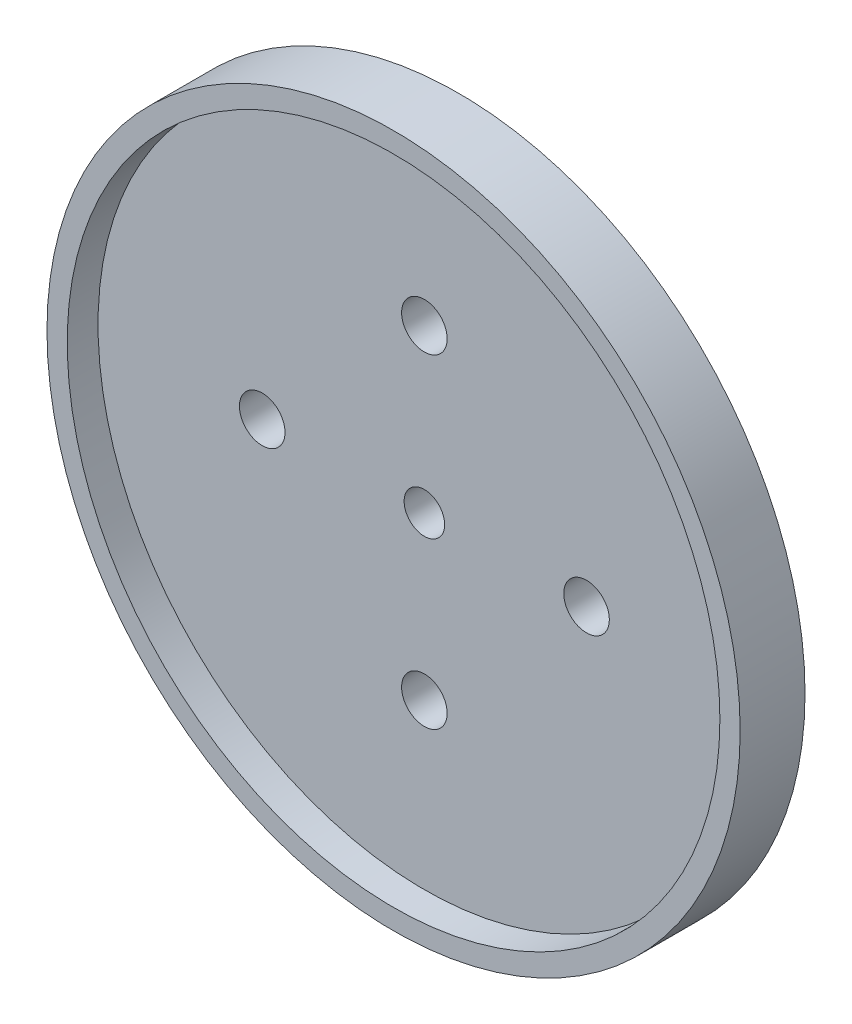
ISO-10303-21;
HEADER;
FILE_DESCRIPTION(('STEP AP214'),'2;1');
FILE_NAME('part.step','',(''),(''),'','','');
FILE_SCHEMA(('AUTOMOTIVE_DESIGN { 1 0 10303 214 1 1 1 1 }'));
ENDSEC;
DATA;
#1=APPLICATION_CONTEXT('core data for automotive mechanical design processes');
#2=APPLICATION_PROTOCOL_DEFINITION('international standard','automotive_design',2000,#1);
#3=PRODUCT_CONTEXT('',#1,'mechanical');
#4=PRODUCT('Part','Part','',(#3));
#5=PRODUCT_RELATED_PRODUCT_CATEGORY('part','',(#4));
#6=PRODUCT_DEFINITION_FORMATION('','',#4);
#7=PRODUCT_DEFINITION_CONTEXT('part definition',#1,'design');
#8=PRODUCT_DEFINITION('design','',#6,#7);
#9=PRODUCT_DEFINITION_SHAPE('','',#8);
#10=(LENGTH_UNIT() NAMED_UNIT(*) SI_UNIT(.MILLI.,.METRE.));
#11=(NAMED_UNIT(*) PLANE_ANGLE_UNIT() SI_UNIT($,.RADIAN.));
#12=(NAMED_UNIT(*) SI_UNIT($,.STERADIAN.) SOLID_ANGLE_UNIT());
#13=UNCERTAINTY_MEASURE_WITH_UNIT(LENGTH_MEASURE(1.E-05),#10,'distance_accuracy_value','');
#14=(GEOMETRIC_REPRESENTATION_CONTEXT(3) GLOBAL_UNCERTAINTY_ASSIGNED_CONTEXT((#13)) GLOBAL_UNIT_ASSIGNED_CONTEXT((#10,
#11,#12)) REPRESENTATION_CONTEXT('',''));
#15=CARTESIAN_POINT('',(0.,0.,0.));
#16=DIRECTION('',(0.,0.,1.));
#17=DIRECTION('',(1.,0.,0.));
#18=AXIS2_PLACEMENT_3D('',#15,#16,#17);
#19=CARTESIAN_POINT('',(0.,0.,10.16));
#20=DIRECTION('',(0.,0.,-1.));
#21=DIRECTION('',(-1.,0.,0.));
#22=AXIS2_PLACEMENT_3D('',#19,#20,#21);
#23=CYLINDRICAL_SURFACE('',#22,54.2925);
#24=CARTESIAN_POINT('',(0.,0.,10.16));
#25=DIRECTION('',(0.,0.,1.));
#26=DIRECTION('',(1.,0.,0.));
#27=AXIS2_PLACEMENT_3D('',#24,#25,#26);
#28=CIRCLE('',#27,54.2925);
#29=CARTESIAN_POINT('',(54.2925,0.,10.16));
#30=VERTEX_POINT('',#29);
#31=EDGE_CURVE('E10',#30,#30,#28,.T.);
#32=ORIENTED_EDGE('',*,*,#31,.F.);
#33=EDGE_LOOP('',(#32));
#34=FACE_BOUND('',#33,.T.);
#35=CARTESIAN_POINT('',(0.,0.,0.));
#36=DIRECTION('',(0.,0.,1.));
#37=DIRECTION('',(1.,0.,0.));
#38=AXIS2_PLACEMENT_3D('',#35,#36,#37);
#39=CIRCLE('',#38,54.2925);
#40=CARTESIAN_POINT('',(54.2925,0.,0.));
#41=VERTEX_POINT('',#40);
#42=EDGE_CURVE('E40',#41,#41,#39,.T.);
#43=ORIENTED_EDGE('',*,*,#42,.T.);
#44=EDGE_LOOP('',(#43));
#45=FACE_BOUND('',#44,.T.);
#46=ADVANCED_FACE('F37',(#34,#45),#23,.T.);
#47=CARTESIAN_POINT('',(0.,0.,10.16));
#48=DIRECTION('',(0.,0.,1.));
#49=DIRECTION('',(1.,0.,0.));
#50=AXIS2_PLACEMENT_3D('',#47,#48,#49);
#51=PLANE('',#50);
#52=CARTESIAN_POINT('',(0.,0.,10.16));
#53=DIRECTION('',(0.,0.,1.));
#54=DIRECTION('',(1.,0.,0.));
#55=AXIS2_PLACEMENT_3D('',#52,#53,#54);
#56=CIRCLE('',#55,51.1175);
#57=CARTESIAN_POINT('',(51.1175,0.,10.16));
#58=VERTEX_POINT('',#57);
#59=EDGE_CURVE('E52',#58,#58,#56,.T.);
#60=ORIENTED_EDGE('',*,*,#59,.F.);
#61=EDGE_LOOP('',(#60));
#62=FACE_BOUND('',#61,.T.);
#63=ORIENTED_EDGE('',*,*,#31,.T.);
#64=EDGE_LOOP('',(#63));
#65=FACE_BOUND('',#64,.T.);
#66=ADVANCED_FACE('F113',(#62,#65),#51,.T.);
#67=CARTESIAN_POINT('',(0.,0.,0.));
#68=DIRECTION('',(0.,0.,1.));
#69=DIRECTION('',(1.,0.,0.));
#70=AXIS2_PLACEMENT_3D('',#67,#68,#69);
#71=PLANE('',#70);
#72=CARTESIAN_POINT('',(2.66051032116535E-13,25.4,0.));
#73=DIRECTION('',(0.,0.,1.));
#74=DIRECTION('',(1.,0.,0.));
#75=AXIS2_PLACEMENT_3D('',#72,#73,#74);
#76=CIRCLE('',#75,3.57124);
#77=CARTESIAN_POINT('',(3.57124000000026,25.4,0.));
#78=VERTEX_POINT('',#77);
#79=EDGE_CURVE('E82',#78,#78,#76,.T.);
#80=ORIENTED_EDGE('',*,*,#79,.T.);
#81=EDGE_LOOP('',(#80));
#82=FACE_BOUND('',#81,.T.);
#83=CARTESIAN_POINT('',(-25.4,1.77367354744357E-13,0.));
#84=DIRECTION('',(0.,0.,1.));
#85=DIRECTION('',(1.,0.,0.));
#86=AXIS2_PLACEMENT_3D('',#83,#84,#85);
#87=CIRCLE('',#86,3.57124);
#88=CARTESIAN_POINT('',(-21.82876,1.77367354744357E-13,0.));
#89=VERTEX_POINT('',#88);
#90=EDGE_CURVE('E76',#89,#89,#87,.T.);
#91=ORIENTED_EDGE('',*,*,#90,.T.);
#92=EDGE_LOOP('',(#91));
#93=FACE_BOUND('',#92,.T.);
#94=CARTESIAN_POINT('',(0.,-25.4,0.));
#95=DIRECTION('',(0.,0.,1.));
#96=DIRECTION('',(1.,0.,0.));
#97=AXIS2_PLACEMENT_3D('',#94,#95,#96);
#98=CIRCLE('',#97,3.57124);
#99=CARTESIAN_POINT('',(3.57123999999991,-25.4,0.));
#100=VERTEX_POINT('',#99);
#101=EDGE_CURVE('E70',#100,#100,#98,.T.);
#102=ORIENTED_EDGE('',*,*,#101,.T.);
#103=EDGE_LOOP('',(#102));
#104=FACE_BOUND('',#103,.T.);
#105=CARTESIAN_POINT('',(25.4,0.,0.));
#106=DIRECTION('',(0.,0.,1.));
#107=DIRECTION('',(1.,0.,0.));
#108=AXIS2_PLACEMENT_3D('',#105,#106,#107);
#109=CIRCLE('',#108,3.57124);
#110=CARTESIAN_POINT('',(28.97124,0.,0.));
#111=VERTEX_POINT('',#110);
#112=EDGE_CURVE('E64',#111,#111,#109,.T.);
#113=ORIENTED_EDGE('',*,*,#112,.T.);
#114=EDGE_LOOP('',(#113));
#115=FACE_BOUND('',#114,.T.);
#116=CARTESIAN_POINT('',(0.,0.,0.));
#117=DIRECTION('',(0.,0.,1.));
#118=DIRECTION('',(1.,0.,0.));
#119=AXIS2_PLACEMENT_3D('',#116,#117,#118);
#120=CIRCLE('',#119,3.17499999999999);
#121=CARTESIAN_POINT('',(3.17499999999999,0.,0.));
#122=VERTEX_POINT('',#121);
#123=EDGE_CURVE('E56',#122,#122,#120,.T.);
#124=ORIENTED_EDGE('',*,*,#123,.T.);
#125=EDGE_LOOP('',(#124));
#126=FACE_BOUND('',#125,.T.);
#127=ORIENTED_EDGE('',*,*,#42,.F.);
#128=EDGE_LOOP('',(#127));
#129=FACE_BOUND('',#128,.T.);
#130=ADVANCED_FACE('F109',(#82,#93,#104,#115,#126,#129),#71,.F.);
#131=CARTESIAN_POINT('',(0.,0.,5.334));
#132=DIRECTION('',(0.,0.,1.));
#133=DIRECTION('',(1.,0.,0.));
#134=AXIS2_PLACEMENT_3D('',#131,#132,#133);
#135=CYLINDRICAL_SURFACE('',#134,51.1175);
#136=CARTESIAN_POINT('',(0.,0.,5.334));
#137=DIRECTION('',(0.,0.,1.));
#138=DIRECTION('',(1.,0.,0.));
#139=AXIS2_PLACEMENT_3D('',#136,#137,#138);
#140=CIRCLE('',#139,51.1175);
#141=CARTESIAN_POINT('',(51.1175,0.,5.334));
#142=VERTEX_POINT('',#141);
#143=EDGE_CURVE('E50',#142,#142,#140,.T.);
#144=ORIENTED_EDGE('',*,*,#143,.F.);
#145=EDGE_LOOP('',(#144));
#146=FACE_BOUND('',#145,.T.);
#147=ORIENTED_EDGE('',*,*,#59,.T.);
#148=EDGE_LOOP('',(#147));
#149=FACE_BOUND('',#148,.T.);
#150=ADVANCED_FACE('F95',(#146,#149),#135,.F.);
#151=CARTESIAN_POINT('',(0.,0.,5.334));
#152=DIRECTION('',(0.,0.,1.));
#153=DIRECTION('',(1.,0.,0.));
#154=AXIS2_PLACEMENT_3D('',#151,#152,#153);
#155=PLANE('',#154);
#156=CARTESIAN_POINT('',(2.66051032116535E-13,25.4,5.334));
#157=DIRECTION('',(0.,0.,1.));
#158=DIRECTION('',(1.,0.,0.));
#159=AXIS2_PLACEMENT_3D('',#156,#157,#158);
#160=CIRCLE('',#159,3.57123999999999);
#161=CARTESIAN_POINT('',(3.57124000000025,25.4,5.334));
#162=VERTEX_POINT('',#161);
#163=EDGE_CURVE('E85',#162,#162,#160,.T.);
#164=ORIENTED_EDGE('',*,*,#163,.F.);
#165=EDGE_LOOP('',(#164));
#166=FACE_BOUND('',#165,.T.);
#167=CARTESIAN_POINT('',(-25.4,1.77367354744357E-13,5.334));
#168=DIRECTION('',(0.,0.,1.));
#169=DIRECTION('',(1.,0.,0.));
#170=AXIS2_PLACEMENT_3D('',#167,#168,#169);
#171=CIRCLE('',#170,3.57123999999999);
#172=CARTESIAN_POINT('',(-21.82876,1.77367354744357E-13,5.334));
#173=VERTEX_POINT('',#172);
#174=EDGE_CURVE('E79',#173,#173,#171,.T.);
#175=ORIENTED_EDGE('',*,*,#174,.F.);
#176=EDGE_LOOP('',(#175));
#177=FACE_BOUND('',#176,.T.);
#178=CARTESIAN_POINT('',(0.,-25.4,5.334));
#179=DIRECTION('',(0.,0.,1.));
#180=DIRECTION('',(1.,0.,0.));
#181=AXIS2_PLACEMENT_3D('',#178,#179,#180);
#182=CIRCLE('',#181,3.57123999999999);
#183=CARTESIAN_POINT('',(3.5712399999999,-25.4,5.334));
#184=VERTEX_POINT('',#183);
#185=EDGE_CURVE('E73',#184,#184,#182,.T.);
#186=ORIENTED_EDGE('',*,*,#185,.F.);
#187=EDGE_LOOP('',(#186));
#188=FACE_BOUND('',#187,.T.);
#189=CARTESIAN_POINT('',(25.4,0.,5.334));
#190=DIRECTION('',(0.,0.,1.));
#191=DIRECTION('',(1.,0.,0.));
#192=AXIS2_PLACEMENT_3D('',#189,#190,#191);
#193=CIRCLE('',#192,3.57123999999999);
#194=CARTESIAN_POINT('',(28.97124,0.,5.334));
#195=VERTEX_POINT('',#194);
#196=EDGE_CURVE('E67',#195,#195,#193,.T.);
#197=ORIENTED_EDGE('',*,*,#196,.F.);
#198=EDGE_LOOP('',(#197));
#199=FACE_BOUND('',#198,.T.);
#200=CARTESIAN_POINT('',(0.,0.,5.334));
#201=DIRECTION('',(0.,0.,1.));
#202=DIRECTION('',(1.,0.,0.));
#203=AXIS2_PLACEMENT_3D('',#200,#201,#202);
#204=CIRCLE('',#203,3.17499999999999);
#205=CARTESIAN_POINT('',(3.17499999999999,0.,5.334));
#206=VERTEX_POINT('',#205);
#207=EDGE_CURVE('E61',#206,#206,#204,.T.);
#208=ORIENTED_EDGE('',*,*,#207,.F.);
#209=EDGE_LOOP('',(#208));
#210=FACE_BOUND('',#209,.T.);
#211=ORIENTED_EDGE('',*,*,#143,.T.);
#212=EDGE_LOOP('',(#211));
#213=FACE_BOUND('',#212,.T.);
#214=ADVANCED_FACE('F91',(#166,#177,#188,#199,#210,#213),#155,.T.);
#215=CARTESIAN_POINT('',(0.,0.,5.334));
#216=DIRECTION('',(0.,0.,1.));
#217=DIRECTION('',(1.,0.,0.));
#218=AXIS2_PLACEMENT_3D('',#215,#216,#217);
#219=CYLINDRICAL_SURFACE('',#218,3.17499999999999);
#220=ORIENTED_EDGE('',*,*,#207,.T.);
#221=EDGE_LOOP('',(#220));
#222=FACE_BOUND('',#221,.T.);
#223=ORIENTED_EDGE('',*,*,#123,.F.);
#224=EDGE_LOOP('',(#223));
#225=FACE_BOUND('',#224,.T.);
#226=ADVANCED_FACE('F94',(#222,#225),#219,.F.);
#227=CARTESIAN_POINT('',(25.4,0.,5.334));
#228=DIRECTION('',(0.,0.,1.));
#229=DIRECTION('',(1.,0.,0.));
#230=AXIS2_PLACEMENT_3D('',#227,#228,#229);
#231=CYLINDRICAL_SURFACE('',#230,3.57123999999999);
#232=ORIENTED_EDGE('',*,*,#112,.F.);
#233=EDGE_LOOP('',(#232));
#234=FACE_BOUND('',#233,.T.);
#235=ORIENTED_EDGE('',*,*,#196,.T.);
#236=EDGE_LOOP('',(#235));
#237=FACE_BOUND('',#236,.T.);
#238=ADVANCED_FACE('F125',(#234,#237),#231,.F.);
#239=CARTESIAN_POINT('',(0.,-25.4,5.334));
#240=DIRECTION('',(0.,0.,1.));
#241=DIRECTION('',(1.,0.,0.));
#242=AXIS2_PLACEMENT_3D('',#239,#240,#241);
#243=CYLINDRICAL_SURFACE('',#242,3.57123999999999);
#244=ORIENTED_EDGE('',*,*,#101,.F.);
#245=EDGE_LOOP('',(#244));
#246=FACE_BOUND('',#245,.T.);
#247=ORIENTED_EDGE('',*,*,#185,.T.);
#248=EDGE_LOOP('',(#247));
#249=FACE_BOUND('',#248,.T.);
#250=ADVANCED_FACE('F129',(#246,#249),#243,.F.);
#251=CARTESIAN_POINT('',(-25.4,1.77367354744357E-13,5.334));
#252=DIRECTION('',(0.,0.,1.));
#253=DIRECTION('',(1.,0.,0.));
#254=AXIS2_PLACEMENT_3D('',#251,#252,#253);
#255=CYLINDRICAL_SURFACE('',#254,3.57123999999999);
#256=ORIENTED_EDGE('',*,*,#90,.F.);
#257=EDGE_LOOP('',(#256));
#258=FACE_BOUND('',#257,.T.);
#259=ORIENTED_EDGE('',*,*,#174,.T.);
#260=EDGE_LOOP('',(#259));
#261=FACE_BOUND('',#260,.T.);
#262=ADVANCED_FACE('F133',(#258,#261),#255,.F.);
#263=CARTESIAN_POINT('',(2.66051032116535E-13,25.4,5.334));
#264=DIRECTION('',(0.,0.,1.));
#265=DIRECTION('',(1.,0.,0.));
#266=AXIS2_PLACEMENT_3D('',#263,#264,#265);
#267=CYLINDRICAL_SURFACE('',#266,3.57123999999999);
#268=ORIENTED_EDGE('',*,*,#79,.F.);
#269=EDGE_LOOP('',(#268));
#270=FACE_BOUND('',#269,.T.);
#271=ORIENTED_EDGE('',*,*,#163,.T.);
#272=EDGE_LOOP('',(#271));
#273=FACE_BOUND('',#272,.T.);
#274=ADVANCED_FACE('F89',(#270,#273),#267,.F.);
#275=CLOSED_SHELL('',(#46,#66,#130,#150,#214,#226,#238,#250,#262,#274));
#276=MANIFOLD_SOLID_BREP('B2',#275);
#277=ADVANCED_BREP_SHAPE_REPRESENTATION('',(#18,#276),#14);
#278=SHAPE_DEFINITION_REPRESENTATION(#9,#277);
ENDSEC;
END-ISO-10303-21;
